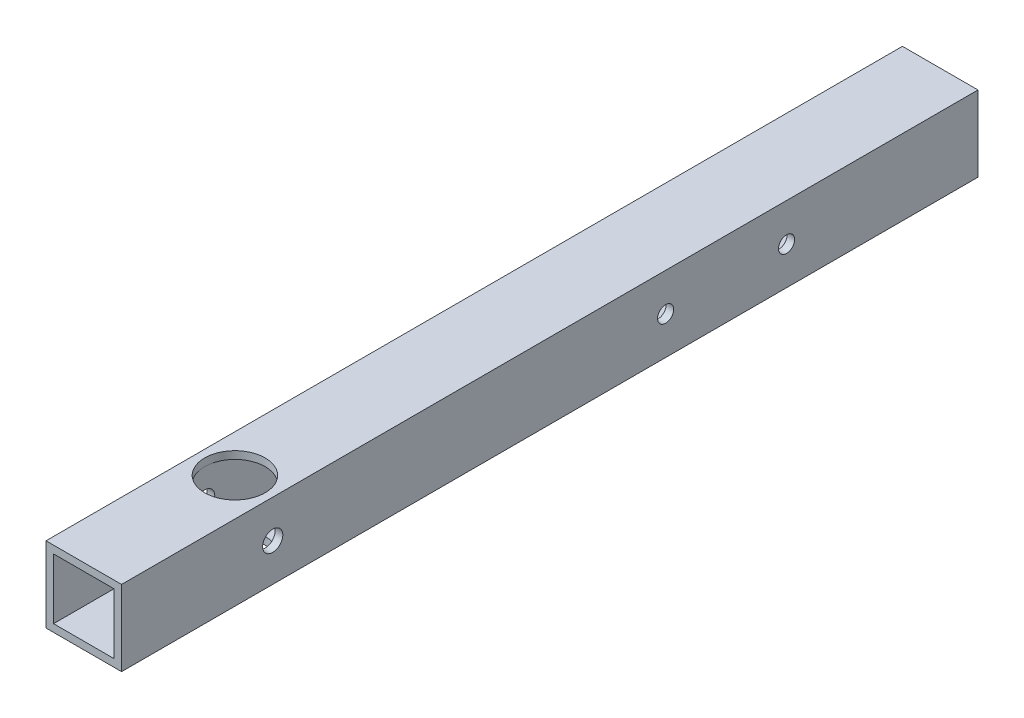
ISO-10303-21;
HEADER;
FILE_DESCRIPTION(('STEP AP214'),'2;1');
FILE_NAME('part.step','',(''),(''),'','','');
FILE_SCHEMA(('AUTOMOTIVE_DESIGN { 1 0 10303 214 1 1 1 1 }'));
ENDSEC;
DATA;
#1=APPLICATION_CONTEXT('core data for automotive mechanical design processes');
#2=APPLICATION_PROTOCOL_DEFINITION('international standard','automotive_design',2000,#1);
#3=PRODUCT_CONTEXT('',#1,'mechanical');
#4=PRODUCT('Part','Part','',(#3));
#5=PRODUCT_RELATED_PRODUCT_CATEGORY('part','',(#4));
#6=PRODUCT_DEFINITION_FORMATION('','',#4);
#7=PRODUCT_DEFINITION_CONTEXT('part definition',#1,'design');
#8=PRODUCT_DEFINITION('design','',#6,#7);
#9=PRODUCT_DEFINITION_SHAPE('','',#8);
#10=(LENGTH_UNIT() NAMED_UNIT(*) SI_UNIT(.MILLI.,.METRE.));
#11=(NAMED_UNIT(*) PLANE_ANGLE_UNIT() SI_UNIT($,.RADIAN.));
#12=(NAMED_UNIT(*) SI_UNIT($,.STERADIAN.) SOLID_ANGLE_UNIT());
#13=UNCERTAINTY_MEASURE_WITH_UNIT(LENGTH_MEASURE(1.E-05),#10,'distance_accuracy_value','');
#14=(GEOMETRIC_REPRESENTATION_CONTEXT(3) GLOBAL_UNCERTAINTY_ASSIGNED_CONTEXT((#13)) GLOBAL_UNIT_ASSIGNED_CONTEXT((#10,
#11,#12)) REPRESENTATION_CONTEXT('',''));
#15=CARTESIAN_POINT('',(0.,0.,0.));
#16=DIRECTION('',(0.,0.,1.));
#17=DIRECTION('',(1.,0.,0.));
#18=AXIS2_PLACEMENT_3D('',#15,#16,#17);
#19=CARTESIAN_POINT('',(0.,6.,160.));
#20=DIRECTION('',(0.,-1.,0.));
#21=DIRECTION('',(0.,0.,-1.));
#22=AXIS2_PLACEMENT_3D('',#19,#20,#21);
#23=PLANE('',#22);
#24=CARTESIAN_POINT('',(0.,6.,140.));
#25=DIRECTION('',(0.,-1.,0.));
#26=DIRECTION('',(0.,0.,-1.));
#27=AXIS2_PLACEMENT_3D('',#24,#25,#26);
#28=CIRCLE('',#27,6.00000000000001);
#29=CARTESIAN_POINT('',(6.,6.,140.));
#30=VERTEX_POINT('',#29);
#31=CARTESIAN_POINT('',(-6.,6.,140.));
#32=VERTEX_POINT('',#31);
#33=EDGE_CURVE('E74',#30,#32,#28,.T.);
#34=ORIENTED_EDGE('',*,*,#33,.F.);
#35=DIRECTION('',(0.,0.,-1.));
#36=VECTOR('',#35,1.);
#37=CARTESIAN_POINT('',(6.,6.,160.));
#38=LINE('',#37,#36);
#39=CARTESIAN_POINT('',(6.,6.,170.));
#40=VERTEX_POINT('',#39);
#41=EDGE_CURVE('E135',#40,#30,#38,.T.);
#42=ORIENTED_EDGE('',*,*,#41,.F.);
#43=DIRECTION('',(-1.,0.,0.));
#44=VECTOR('',#43,1.);
#45=CARTESIAN_POINT('',(-6.,6.,170.));
#46=LINE('',#45,#44);
#47=CARTESIAN_POINT('',(-6.,6.,170.));
#48=VERTEX_POINT('',#47);
#49=EDGE_CURVE('E139',#40,#48,#46,.T.);
#50=ORIENTED_EDGE('',*,*,#49,.T.);
#51=DIRECTION('',(0.,0.,-1.));
#52=VECTOR('',#51,1.);
#53=CARTESIAN_POINT('',(-6.,6.,160.));
#54=LINE('',#53,#52);
#55=EDGE_CURVE('E232',#48,#32,#54,.T.);
#56=ORIENTED_EDGE('',*,*,#55,.T.);
#57=EDGE_LOOP('',(#34,#42,#50,#56));
#58=FACE_BOUND('',#57,.T.);
#59=ADVANCED_FACE('F58',(#58),#23,.T.);
#60=CARTESIAN_POINT('',(0.,-6.,160.));
#61=DIRECTION('',(0.,1.,0.));
#62=DIRECTION('',(0.,0.,1.));
#63=AXIS2_PLACEMENT_3D('',#60,#61,#62);
#64=PLANE('',#63);
#65=CARTESIAN_POINT('',(0.,-6.,140.));
#66=DIRECTION('',(0.,1.,0.));
#67=DIRECTION('',(0.,0.,1.));
#68=AXIS2_PLACEMENT_3D('',#65,#66,#67);
#69=CIRCLE('',#68,6.00000000000001);
#70=CARTESIAN_POINT('',(6.,-6.,140.));
#71=VERTEX_POINT('',#70);
#72=CARTESIAN_POINT('',(-6.,-6.,140.));
#73=VERTEX_POINT('',#72);
#74=EDGE_CURVE('E12',#71,#73,#69,.T.);
#75=ORIENTED_EDGE('',*,*,#74,.F.);
#76=DIRECTION('',(0.,0.,-1.));
#77=VECTOR('',#76,1.);
#78=CARTESIAN_POINT('',(6.,-6.,160.));
#79=LINE('',#78,#77);
#80=CARTESIAN_POINT('',(6.,-6.,0.));
#81=VERTEX_POINT('',#80);
#82=EDGE_CURVE('E225',#71,#81,#79,.T.);
#83=ORIENTED_EDGE('',*,*,#82,.T.);
#84=DIRECTION('',(1.,0.,0.));
#85=VECTOR('',#84,1.);
#86=CARTESIAN_POINT('',(0.,-6.,0.));
#87=LINE('',#86,#85);
#88=CARTESIAN_POINT('',(-6.,-6.,0.));
#89=VERTEX_POINT('',#88);
#90=EDGE_CURVE('E222',#89,#81,#87,.T.);
#91=ORIENTED_EDGE('',*,*,#90,.F.);
#92=DIRECTION('',(0.,0.,-1.));
#93=VECTOR('',#92,1.);
#94=CARTESIAN_POINT('',(-6.,-6.,160.));
#95=LINE('',#94,#93);
#96=EDGE_CURVE('E227',#73,#89,#95,.T.);
#97=ORIENTED_EDGE('',*,*,#96,.F.);
#98=EDGE_LOOP('',(#75,#83,#91,#97));
#99=FACE_BOUND('',#98,.T.);
#100=ADVANCED_FACE('F275',(#99),#64,.T.);
#101=CARTESIAN_POINT('',(0.,0.,0.));
#102=DIRECTION('',(0.,0.,1.));
#103=DIRECTION('',(1.,0.,0.));
#104=AXIS2_PLACEMENT_3D('',#101,#102,#103);
#105=PLANE('',#104);
#106=DIRECTION('',(0.,1.,0.));
#107=VECTOR('',#106,1.);
#108=CARTESIAN_POINT('',(7.5,-7.5,0.));
#109=LINE('',#108,#107);
#110=CARTESIAN_POINT('',(7.5,-7.5,0.));
#111=VERTEX_POINT('',#110);
#112=CARTESIAN_POINT('',(7.5,7.5,0.));
#113=VERTEX_POINT('',#112);
#114=EDGE_CURVE('E143',#111,#113,#109,.T.);
#115=ORIENTED_EDGE('',*,*,#114,.F.);
#116=DIRECTION('',(1.,0.,0.));
#117=VECTOR('',#116,1.);
#118=CARTESIAN_POINT('',(-7.5,-7.5,0.));
#119=LINE('',#118,#117);
#120=CARTESIAN_POINT('',(-7.5,-7.5,0.));
#121=VERTEX_POINT('',#120);
#122=EDGE_CURVE('E240',#121,#111,#119,.T.);
#123=ORIENTED_EDGE('',*,*,#122,.F.);
#124=DIRECTION('',(0.,-1.,0.));
#125=VECTOR('',#124,1.);
#126=CARTESIAN_POINT('',(-7.5,-7.5,0.));
#127=LINE('',#126,#125);
#128=CARTESIAN_POINT('',(-7.5,7.5,0.));
#129=VERTEX_POINT('',#128);
#130=EDGE_CURVE('E238',#129,#121,#127,.T.);
#131=ORIENTED_EDGE('',*,*,#130,.F.);
#132=DIRECTION('',(-1.,0.,0.));
#133=VECTOR('',#132,1.);
#134=CARTESIAN_POINT('',(-7.5,7.5,0.));
#135=LINE('',#134,#133);
#136=EDGE_CURVE('E236',#113,#129,#135,.T.);
#137=ORIENTED_EDGE('',*,*,#136,.F.);
#138=EDGE_LOOP('',(#115,#123,#131,#137));
#139=FACE_BOUND('',#138,.T.);
#140=DIRECTION('',(0.,1.,0.));
#141=VECTOR('',#140,1.);
#142=CARTESIAN_POINT('',(6.,0.,0.));
#143=LINE('',#142,#141);
#144=CARTESIAN_POINT('',(6.,6.,0.));
#145=VERTEX_POINT('',#144);
#146=EDGE_CURVE('E213',#81,#145,#143,.T.);
#147=ORIENTED_EDGE('',*,*,#146,.T.);
#148=DIRECTION('',(-1.,0.,0.));
#149=VECTOR('',#148,1.);
#150=CARTESIAN_POINT('',(0.,6.,0.));
#151=LINE('',#150,#149);
#152=CARTESIAN_POINT('',(-6.,6.,0.));
#153=VERTEX_POINT('',#152);
#154=EDGE_CURVE('E216',#145,#153,#151,.T.);
#155=ORIENTED_EDGE('',*,*,#154,.T.);
#156=DIRECTION('',(0.,-1.,0.));
#157=VECTOR('',#156,1.);
#158=CARTESIAN_POINT('',(-6.,0.,0.));
#159=LINE('',#158,#157);
#160=EDGE_CURVE('E219',#153,#89,#159,.T.);
#161=ORIENTED_EDGE('',*,*,#160,.T.);
#162=ORIENTED_EDGE('',*,*,#90,.T.);
#163=EDGE_LOOP('',(#147,#155,#161,#162));
#164=FACE_BOUND('',#163,.T.);
#165=ADVANCED_FACE('F278',(#139,#164),#105,.F.);
#166=CARTESIAN_POINT('',(7.5,-7.5,160.));
#167=DIRECTION('',(-1.,0.,0.));
#168=DIRECTION('',(0.,0.,1.));
#169=AXIS2_PLACEMENT_3D('',#166,#167,#168);
#170=PLANE('',#169);
#171=CARTESIAN_POINT('',(7.5,-2.45271055457008E-13,38.));
#172=DIRECTION('',(-1.,0.,0.));
#173=DIRECTION('',(0.,0.,1.));
#174=AXIS2_PLACEMENT_3D('',#171,#172,#173);
#175=CIRCLE('',#174,1.6);
#176=CARTESIAN_POINT('',(7.5,-2.45271055457008E-13,39.6));
#177=VERTEX_POINT('',#176);
#178=EDGE_CURVE('E192',#177,#177,#175,.T.);
#179=ORIENTED_EDGE('',*,*,#178,.T.);
#180=EDGE_LOOP('',(#179));
#181=FACE_BOUND('',#180,.T.);
#182=CARTESIAN_POINT('',(7.5,0.,62.));
#183=DIRECTION('',(-1.,0.,0.));
#184=DIRECTION('',(0.,0.,1.));
#185=AXIS2_PLACEMENT_3D('',#182,#183,#184);
#186=CIRCLE('',#185,1.6);
#187=CARTESIAN_POINT('',(7.5,0.,63.6));
#188=VERTEX_POINT('',#187);
#189=EDGE_CURVE('E186',#188,#188,#186,.T.);
#190=ORIENTED_EDGE('',*,*,#189,.T.);
#191=EDGE_LOOP('',(#190));
#192=FACE_BOUND('',#191,.T.);
#193=CARTESIAN_POINT('',(7.5,0.,140.));
#194=DIRECTION('',(-1.,0.,0.));
#195=DIRECTION('',(0.,0.,1.));
#196=AXIS2_PLACEMENT_3D('',#193,#194,#195);
#197=CIRCLE('',#196,2.);
#198=CARTESIAN_POINT('',(7.5,0.,142.));
#199=VERTEX_POINT('',#198);
#200=EDGE_CURVE('E196',#199,#199,#197,.T.);
#201=ORIENTED_EDGE('',*,*,#200,.T.);
#202=EDGE_LOOP('',(#201));
#203=FACE_BOUND('',#202,.T.);
#204=ORIENTED_EDGE('',*,*,#114,.T.);
#205=DIRECTION('',(0.,0.,-1.));
#206=VECTOR('',#205,1.);
#207=CARTESIAN_POINT('',(7.5,7.5,160.));
#208=LINE('',#207,#206);
#209=CARTESIAN_POINT('',(7.5,7.5,170.));
#210=VERTEX_POINT('',#209);
#211=EDGE_CURVE('E251',#210,#113,#208,.T.);
#212=ORIENTED_EDGE('',*,*,#211,.F.);
#213=DIRECTION('',(0.,1.,0.));
#214=VECTOR('',#213,1.);
#215=CARTESIAN_POINT('',(7.5,-7.5,170.));
#216=LINE('',#215,#214);
#217=CARTESIAN_POINT('',(7.5,-7.5,170.));
#218=VERTEX_POINT('',#217);
#219=EDGE_CURVE('E164',#218,#210,#216,.T.);
#220=ORIENTED_EDGE('',*,*,#219,.F.);
#221=DIRECTION('',(0.,0.,-1.));
#222=VECTOR('',#221,1.);
#223=CARTESIAN_POINT('',(7.5,-7.5,160.));
#224=LINE('',#223,#222);
#225=EDGE_CURVE('E242',#218,#111,#224,.T.);
#226=ORIENTED_EDGE('',*,*,#225,.T.);
#227=EDGE_LOOP('',(#204,#212,#220,#226));
#228=FACE_BOUND('',#227,.T.);
#229=ADVANCED_FACE('F60',(#181,#192,#203,#228),#170,.F.);
#230=CARTESIAN_POINT('',(-7.5,7.5,160.));
#231=DIRECTION('',(0.,-1.,0.));
#232=DIRECTION('',(0.,0.,-1.));
#233=AXIS2_PLACEMENT_3D('',#230,#231,#232);
#234=PLANE('',#233);
#235=CARTESIAN_POINT('',(0.,7.5,140.));
#236=DIRECTION('',(0.,-1.,0.));
#237=DIRECTION('',(0.,0.,1.));
#238=AXIS2_PLACEMENT_3D('',#235,#236,#237);
#239=CIRCLE('',#238,6.00000000000001);
#240=CARTESIAN_POINT('',(0.,7.5,146.));
#241=VERTEX_POINT('',#240);
#242=EDGE_CURVE('E206',#241,#241,#239,.T.);
#243=ORIENTED_EDGE('',*,*,#242,.T.);
#244=EDGE_LOOP('',(#243));
#245=FACE_BOUND('',#244,.T.);
#246=ORIENTED_EDGE('',*,*,#136,.T.);
#247=DIRECTION('',(0.,0.,-1.));
#248=VECTOR('',#247,1.);
#249=CARTESIAN_POINT('',(-7.5,7.5,160.));
#250=LINE('',#249,#248);
#251=CARTESIAN_POINT('',(-7.5,7.5,170.));
#252=VERTEX_POINT('',#251);
#253=EDGE_CURVE('E248',#252,#129,#250,.T.);
#254=ORIENTED_EDGE('',*,*,#253,.F.);
#255=DIRECTION('',(-1.,0.,0.));
#256=VECTOR('',#255,1.);
#257=CARTESIAN_POINT('',(-7.5,7.5,170.));
#258=LINE('',#257,#256);
#259=EDGE_CURVE('E167',#210,#252,#258,.T.);
#260=ORIENTED_EDGE('',*,*,#259,.F.);
#261=ORIENTED_EDGE('',*,*,#211,.T.);
#262=EDGE_LOOP('',(#246,#254,#260,#261));
#263=FACE_BOUND('',#262,.T.);
#264=ADVANCED_FACE('F290',(#245,#263),#234,.F.);
#265=CARTESIAN_POINT('',(-7.5,-7.5,160.));
#266=DIRECTION('',(1.,0.,0.));
#267=DIRECTION('',(0.,0.,-1.));
#268=AXIS2_PLACEMENT_3D('',#265,#266,#267);
#269=PLANE('',#268);
#270=CARTESIAN_POINT('',(-7.5,-2.45271055457008E-13,38.));
#271=DIRECTION('',(1.,0.,0.));
#272=DIRECTION('',(0.,0.,-1.));
#273=AXIS2_PLACEMENT_3D('',#270,#271,#272);
#274=CIRCLE('',#273,1.6);
#275=CARTESIAN_POINT('',(-7.5,-2.45271055457008E-13,36.4));
#276=VERTEX_POINT('',#275);
#277=EDGE_CURVE('E177',#276,#276,#274,.T.);
#278=ORIENTED_EDGE('',*,*,#277,.T.);
#279=EDGE_LOOP('',(#278));
#280=FACE_BOUND('',#279,.T.);
#281=CARTESIAN_POINT('',(-7.5,0.,62.));
#282=DIRECTION('',(1.,0.,0.));
#283=DIRECTION('',(0.,0.,-1.));
#284=AXIS2_PLACEMENT_3D('',#281,#282,#283);
#285=CIRCLE('',#284,1.6);
#286=CARTESIAN_POINT('',(-7.5,0.,60.4));
#287=VERTEX_POINT('',#286);
#288=EDGE_CURVE('E176',#287,#287,#285,.T.);
#289=ORIENTED_EDGE('',*,*,#288,.T.);
#290=EDGE_LOOP('',(#289));
#291=FACE_BOUND('',#290,.T.);
#292=CARTESIAN_POINT('',(-7.5,0.,140.));
#293=DIRECTION('',(-1.,0.,0.));
#294=DIRECTION('',(0.,0.,1.));
#295=AXIS2_PLACEMENT_3D('',#292,#293,#294);
#296=CIRCLE('',#295,2.);
#297=CARTESIAN_POINT('',(-7.5,0.,142.));
#298=VERTEX_POINT('',#297);
#299=EDGE_CURVE('E195',#298,#298,#296,.T.);
#300=ORIENTED_EDGE('',*,*,#299,.F.);
#301=EDGE_LOOP('',(#300));
#302=FACE_BOUND('',#301,.T.);
#303=ORIENTED_EDGE('',*,*,#130,.T.);
#304=DIRECTION('',(0.,0.,-1.));
#305=VECTOR('',#304,1.);
#306=CARTESIAN_POINT('',(-7.5,-7.5,160.));
#307=LINE('',#306,#305);
#308=CARTESIAN_POINT('',(-7.5,-7.5,170.));
#309=VERTEX_POINT('',#308);
#310=EDGE_CURVE('E245',#309,#121,#307,.T.);
#311=ORIENTED_EDGE('',*,*,#310,.F.);
#312=DIRECTION('',(0.,-1.,0.));
#313=VECTOR('',#312,1.);
#314=CARTESIAN_POINT('',(-7.5,-7.5,170.));
#315=LINE('',#314,#313);
#316=EDGE_CURVE('E170',#252,#309,#315,.T.);
#317=ORIENTED_EDGE('',*,*,#316,.F.);
#318=ORIENTED_EDGE('',*,*,#253,.T.);
#319=EDGE_LOOP('',(#303,#311,#317,#318));
#320=FACE_BOUND('',#319,.T.);
#321=ADVANCED_FACE('F293',(#280,#291,#302,#320),#269,.F.);
#322=CARTESIAN_POINT('',(-7.5,-7.5,160.));
#323=DIRECTION('',(0.,1.,0.));
#324=DIRECTION('',(0.,0.,1.));
#325=AXIS2_PLACEMENT_3D('',#322,#323,#324);
#326=PLANE('',#325);
#327=CARTESIAN_POINT('',(0.,-7.5,140.));
#328=DIRECTION('',(0.,-1.,0.));
#329=DIRECTION('',(0.,0.,1.));
#330=AXIS2_PLACEMENT_3D('',#327,#328,#329);
#331=CIRCLE('',#330,6.00000000000001);
#332=CARTESIAN_POINT('',(0.,-7.5,146.));
#333=VERTEX_POINT('',#332);
#334=EDGE_CURVE('E205',#333,#333,#331,.T.);
#335=ORIENTED_EDGE('',*,*,#334,.F.);
#336=EDGE_LOOP('',(#335));
#337=FACE_BOUND('',#336,.T.);
#338=ORIENTED_EDGE('',*,*,#122,.T.);
#339=ORIENTED_EDGE('',*,*,#225,.F.);
#340=DIRECTION('',(1.,0.,0.));
#341=VECTOR('',#340,1.);
#342=CARTESIAN_POINT('',(-7.5,-7.5,170.));
#343=LINE('',#342,#341);
#344=EDGE_CURVE('E173',#309,#218,#343,.T.);
#345=ORIENTED_EDGE('',*,*,#344,.F.);
#346=ORIENTED_EDGE('',*,*,#310,.T.);
#347=EDGE_LOOP('',(#338,#339,#345,#346));
#348=FACE_BOUND('',#347,.T.);
#349=ADVANCED_FACE('F302',(#337,#348),#326,.F.);
#350=CARTESIAN_POINT('',(6.,0.,160.));
#351=DIRECTION('',(-1.,0.,0.));
#352=DIRECTION('',(0.,0.,1.));
#353=AXIS2_PLACEMENT_3D('',#350,#351,#352);
#354=PLANE('',#353);
#355=CARTESIAN_POINT('',(6.,-2.45271055457008E-13,38.));
#356=DIRECTION('',(-1.,0.,0.));
#357=DIRECTION('',(0.,0.,1.));
#358=AXIS2_PLACEMENT_3D('',#355,#356,#357);
#359=CIRCLE('',#358,1.6);
#360=CARTESIAN_POINT('',(6.,-2.45271055457008E-13,39.6));
#361=VERTEX_POINT('',#360);
#362=EDGE_CURVE('E189',#361,#361,#359,.T.);
#363=ORIENTED_EDGE('',*,*,#362,.F.);
#364=EDGE_LOOP('',(#363));
#365=FACE_BOUND('',#364,.T.);
#366=CARTESIAN_POINT('',(6.,0.,62.));
#367=DIRECTION('',(-1.,0.,0.));
#368=DIRECTION('',(0.,0.,1.));
#369=AXIS2_PLACEMENT_3D('',#366,#367,#368);
#370=CIRCLE('',#369,1.6);
#371=CARTESIAN_POINT('',(6.,0.,63.6));
#372=VERTEX_POINT('',#371);
#373=EDGE_CURVE('E183',#372,#372,#370,.T.);
#374=ORIENTED_EDGE('',*,*,#373,.F.);
#375=EDGE_LOOP('',(#374));
#376=FACE_BOUND('',#375,.T.);
#377=CARTESIAN_POINT('',(6.,0.,140.));
#378=DIRECTION('',(-1.,0.,0.));
#379=DIRECTION('',(0.,0.,1.));
#380=AXIS2_PLACEMENT_3D('',#377,#378,#379);
#381=CIRCLE('',#380,2.);
#382=CARTESIAN_POINT('',(6.,0.,142.));
#383=VERTEX_POINT('',#382);
#384=EDGE_CURVE('E202',#383,#383,#381,.T.);
#385=ORIENTED_EDGE('',*,*,#384,.F.);
#386=EDGE_LOOP('',(#385));
#387=FACE_BOUND('',#386,.T.);
#388=ORIENTED_EDGE('',*,*,#82,.F.);
#389=CARTESIAN_POINT('',(6.,-6.,170.));
#390=VERTEX_POINT('',#389);
#391=EDGE_CURVE('E151',#390,#71,#79,.T.);
#392=ORIENTED_EDGE('',*,*,#391,.F.);
#393=DIRECTION('',(0.,1.,0.));
#394=VECTOR('',#393,1.);
#395=CARTESIAN_POINT('',(6.,-6.,170.));
#396=LINE('',#395,#394);
#397=EDGE_CURVE('E147',#390,#40,#396,.T.);
#398=ORIENTED_EDGE('',*,*,#397,.T.);
#399=ORIENTED_EDGE('',*,*,#41,.T.);
#400=EDGE_CURVE('E144',#30,#145,#38,.T.);
#401=ORIENTED_EDGE('',*,*,#400,.T.);
#402=ORIENTED_EDGE('',*,*,#146,.F.);
#403=EDGE_LOOP('',(#388,#392,#398,#399,#401,#402));
#404=FACE_BOUND('',#403,.T.);
#405=ADVANCED_FACE('F149',(#365,#376,#387,#404),#354,.T.);
#406=EDGE_CURVE('E209',#32,#30,#28,.T.);
#407=ORIENTED_EDGE('',*,*,#406,.F.);
#408=EDGE_CURVE('E231',#32,#153,#54,.T.);
#409=ORIENTED_EDGE('',*,*,#408,.T.);
#410=ORIENTED_EDGE('',*,*,#154,.F.);
#411=ORIENTED_EDGE('',*,*,#400,.F.);
#412=EDGE_LOOP('',(#407,#409,#410,#411));
#413=FACE_BOUND('',#412,.T.);
#414=ADVANCED_FACE('F265',(#413),#23,.T.);
#415=CARTESIAN_POINT('',(-6.,0.,160.));
#416=DIRECTION('',(1.,0.,0.));
#417=DIRECTION('',(0.,0.,-1.));
#418=AXIS2_PLACEMENT_3D('',#415,#416,#417);
#419=PLANE('',#418);
#420=CARTESIAN_POINT('',(-6.,-2.45271055457008E-13,38.));
#421=DIRECTION('',(1.,0.,0.));
#422=DIRECTION('',(0.,0.,-1.));
#423=AXIS2_PLACEMENT_3D('',#420,#421,#422);
#424=CIRCLE('',#423,1.6);
#425=CARTESIAN_POINT('',(-6.,-2.45271055457008E-13,36.4));
#426=VERTEX_POINT('',#425);
#427=EDGE_CURVE('E62',#426,#426,#424,.T.);
#428=ORIENTED_EDGE('',*,*,#427,.F.);
#429=EDGE_LOOP('',(#428));
#430=FACE_BOUND('',#429,.T.);
#431=CARTESIAN_POINT('',(-6.,0.,62.));
#432=DIRECTION('',(1.,0.,0.));
#433=DIRECTION('',(0.,0.,-1.));
#434=AXIS2_PLACEMENT_3D('',#431,#432,#433);
#435=CIRCLE('',#434,1.6);
#436=CARTESIAN_POINT('',(-6.,0.,60.4));
#437=VERTEX_POINT('',#436);
#438=EDGE_CURVE('E180',#437,#437,#435,.T.);
#439=ORIENTED_EDGE('',*,*,#438,.F.);
#440=EDGE_LOOP('',(#439));
#441=FACE_BOUND('',#440,.T.);
#442=CARTESIAN_POINT('',(-6.,0.,140.));
#443=DIRECTION('',(1.,0.,0.));
#444=DIRECTION('',(0.,0.,-1.));
#445=AXIS2_PLACEMENT_3D('',#442,#443,#444);
#446=CIRCLE('',#445,2.);
#447=CARTESIAN_POINT('',(-6.,0.,138.));
#448=VERTEX_POINT('',#447);
#449=EDGE_CURVE('E199',#448,#448,#446,.T.);
#450=ORIENTED_EDGE('',*,*,#449,.F.);
#451=EDGE_LOOP('',(#450));
#452=FACE_BOUND('',#451,.T.);
#453=CARTESIAN_POINT('',(-6.,-6.,170.));
#454=VERTEX_POINT('',#453);
#455=EDGE_CURVE('E228',#454,#73,#95,.T.);
#456=ORIENTED_EDGE('',*,*,#455,.T.);
#457=ORIENTED_EDGE('',*,*,#96,.T.);
#458=ORIENTED_EDGE('',*,*,#160,.F.);
#459=ORIENTED_EDGE('',*,*,#408,.F.);
#460=ORIENTED_EDGE('',*,*,#55,.F.);
#461=DIRECTION('',(0.,-1.,0.));
#462=VECTOR('',#461,1.);
#463=CARTESIAN_POINT('',(-6.,-6.,170.));
#464=LINE('',#463,#462);
#465=EDGE_CURVE('E158',#48,#454,#464,.T.);
#466=ORIENTED_EDGE('',*,*,#465,.T.);
#467=EDGE_LOOP('',(#456,#457,#458,#459,#460,#466));
#468=FACE_BOUND('',#467,.T.);
#469=ADVANCED_FACE('F261',(#430,#441,#452,#468),#419,.T.);
#470=EDGE_CURVE('E67',#73,#71,#69,.T.);
#471=ORIENTED_EDGE('',*,*,#470,.F.);
#472=ORIENTED_EDGE('',*,*,#455,.F.);
#473=DIRECTION('',(1.,0.,0.));
#474=VECTOR('',#473,1.);
#475=CARTESIAN_POINT('',(-6.,-6.,170.));
#476=LINE('',#475,#474);
#477=EDGE_CURVE('E160',#454,#390,#476,.T.);
#478=ORIENTED_EDGE('',*,*,#477,.T.);
#479=ORIENTED_EDGE('',*,*,#391,.T.);
#480=EDGE_LOOP('',(#471,#472,#478,#479));
#481=FACE_BOUND('',#480,.T.);
#482=ADVANCED_FACE('F264',(#481),#64,.T.);
#483=CARTESIAN_POINT('',(0.,7.5,140.));
#484=DIRECTION('',(0.,-1.,0.));
#485=DIRECTION('',(0.,0.,-1.));
#486=AXIS2_PLACEMENT_3D('',#483,#484,#485);
#487=CYLINDRICAL_SURFACE('',#486,6.00000000000001);
#488=ORIENTED_EDGE('',*,*,#74,.T.);
#489=ORIENTED_EDGE('',*,*,#470,.T.);
#490=EDGE_LOOP('',(#488,#489));
#491=FACE_BOUND('',#490,.T.);
#492=ORIENTED_EDGE('',*,*,#334,.T.);
#493=EDGE_LOOP('',(#492));
#494=FACE_BOUND('',#493,.T.);
#495=ADVANCED_FACE('F286',(#491,#494),#487,.F.);
#496=ORIENTED_EDGE('',*,*,#33,.T.);
#497=ORIENTED_EDGE('',*,*,#406,.T.);
#498=EDGE_LOOP('',(#496,#497));
#499=FACE_BOUND('',#498,.T.);
#500=ORIENTED_EDGE('',*,*,#242,.F.);
#501=EDGE_LOOP('',(#500));
#502=FACE_BOUND('',#501,.T.);
#503=ADVANCED_FACE('F282',(#499,#502),#487,.F.);
#504=CARTESIAN_POINT('',(7.5,0.,140.));
#505=DIRECTION('',(-1.,0.,0.));
#506=DIRECTION('',(0.,0.,1.));
#507=AXIS2_PLACEMENT_3D('',#504,#505,#506);
#508=CYLINDRICAL_SURFACE('',#507,2.);
#509=ORIENTED_EDGE('',*,*,#449,.T.);
#510=EDGE_LOOP('',(#509));
#511=FACE_BOUND('',#510,.T.);
#512=ORIENTED_EDGE('',*,*,#299,.T.);
#513=EDGE_LOOP('',(#512));
#514=FACE_BOUND('',#513,.T.);
#515=ADVANCED_FACE('F285',(#511,#514),#508,.F.);
#516=ORIENTED_EDGE('',*,*,#384,.T.);
#517=EDGE_LOOP('',(#516));
#518=FACE_BOUND('',#517,.T.);
#519=ORIENTED_EDGE('',*,*,#200,.F.);
#520=EDGE_LOOP('',(#519));
#521=FACE_BOUND('',#520,.T.);
#522=ADVANCED_FACE('F350',(#518,#521),#508,.F.);
#523=CARTESIAN_POINT('',(-7.5,0.,62.));
#524=DIRECTION('',(1.,0.,0.));
#525=DIRECTION('',(0.,0.,-1.));
#526=AXIS2_PLACEMENT_3D('',#523,#524,#525);
#527=CYLINDRICAL_SURFACE('',#526,1.6);
#528=ORIENTED_EDGE('',*,*,#438,.T.);
#529=EDGE_LOOP('',(#528));
#530=FACE_BOUND('',#529,.T.);
#531=ORIENTED_EDGE('',*,*,#288,.F.);
#532=EDGE_LOOP('',(#531));
#533=FACE_BOUND('',#532,.T.);
#534=ADVANCED_FACE('F258',(#530,#533),#527,.F.);
#535=CARTESIAN_POINT('',(-7.5,-2.45271055457008E-13,38.));
#536=DIRECTION('',(1.,0.,0.));
#537=DIRECTION('',(0.,0.,-1.));
#538=AXIS2_PLACEMENT_3D('',#535,#536,#537);
#539=CYLINDRICAL_SURFACE('',#538,1.6);
#540=ORIENTED_EDGE('',*,*,#427,.T.);
#541=EDGE_LOOP('',(#540));
#542=FACE_BOUND('',#541,.T.);
#543=ORIENTED_EDGE('',*,*,#277,.F.);
#544=EDGE_LOOP('',(#543));
#545=FACE_BOUND('',#544,.T.);
#546=ADVANCED_FACE('F316',(#542,#545),#539,.F.);
#547=ORIENTED_EDGE('',*,*,#373,.T.);
#548=EDGE_LOOP('',(#547));
#549=FACE_BOUND('',#548,.T.);
#550=ORIENTED_EDGE('',*,*,#189,.F.);
#551=EDGE_LOOP('',(#550));
#552=FACE_BOUND('',#551,.T.);
#553=ADVANCED_FACE('F313',(#549,#552),#527,.F.);
#554=ORIENTED_EDGE('',*,*,#362,.T.);
#555=EDGE_LOOP('',(#554));
#556=FACE_BOUND('',#555,.T.);
#557=ORIENTED_EDGE('',*,*,#178,.F.);
#558=EDGE_LOOP('',(#557));
#559=FACE_BOUND('',#558,.T.);
#560=ADVANCED_FACE('F308',(#556,#559),#539,.F.);
#561=CARTESIAN_POINT('',(0.,0.,170.));
#562=DIRECTION('',(0.,0.,-1.));
#563=DIRECTION('',(-1.,0.,0.));
#564=AXIS2_PLACEMENT_3D('',#561,#562,#563);
#565=PLANE('',#564);
#566=ORIENTED_EDGE('',*,*,#219,.T.);
#567=ORIENTED_EDGE('',*,*,#259,.T.);
#568=ORIENTED_EDGE('',*,*,#316,.T.);
#569=ORIENTED_EDGE('',*,*,#344,.T.);
#570=EDGE_LOOP('',(#566,#567,#568,#569));
#571=FACE_BOUND('',#570,.T.);
#572=ORIENTED_EDGE('',*,*,#397,.F.);
#573=ORIENTED_EDGE('',*,*,#477,.F.);
#574=ORIENTED_EDGE('',*,*,#465,.F.);
#575=ORIENTED_EDGE('',*,*,#49,.F.);
#576=EDGE_LOOP('',(#572,#573,#574,#575));
#577=FACE_BOUND('',#576,.T.);
#578=ADVANCED_FACE('F156',(#571,#577),#565,.F.);
#579=CLOSED_SHELL('',(#59,#100,#165,#229,#264,#321,#349,#405,#414,#469,#482,#495,#503,#515,#522,
#534,#546,#553,#560,#578));
#580=MANIFOLD_SOLID_BREP('B2',#579);
#581=ADVANCED_BREP_SHAPE_REPRESENTATION('',(#18,#580),#14);
#582=SHAPE_DEFINITION_REPRESENTATION(#9,#581);
ENDSEC;
END-ISO-10303-21;
